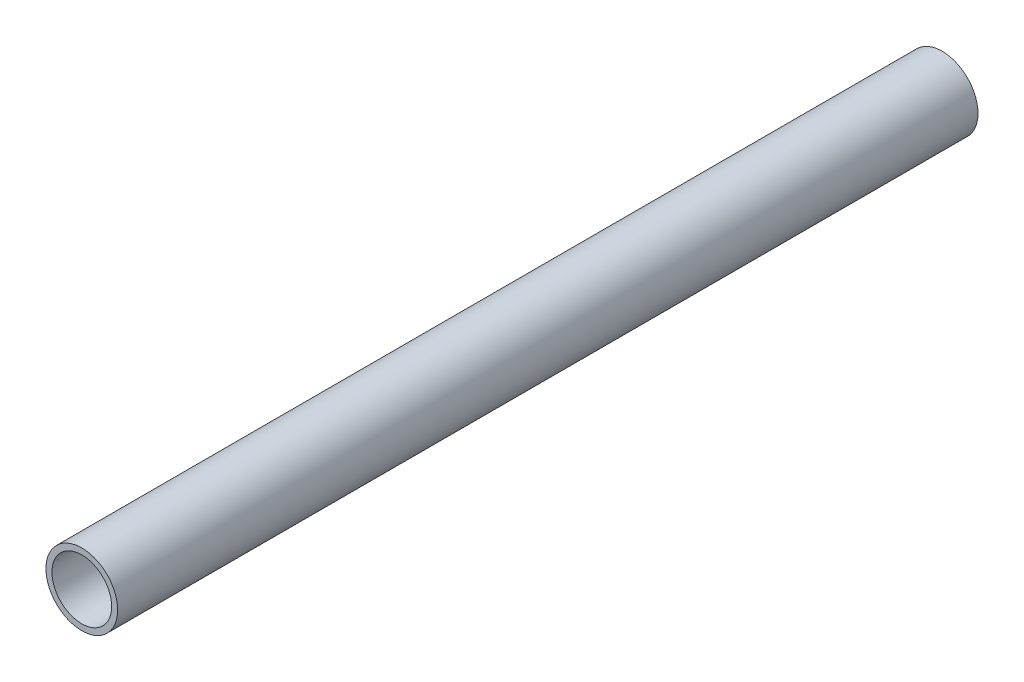
ISO-10303-21;
HEADER;
FILE_DESCRIPTION(('STEP AP214'),'2;1');
FILE_NAME('part.step','',(''),(''),'','','');
FILE_SCHEMA(('AUTOMOTIVE_DESIGN { 1 0 10303 214 1 1 1 1 }'));
ENDSEC;
DATA;
#1=APPLICATION_CONTEXT('core data for automotive mechanical design processes');
#2=APPLICATION_PROTOCOL_DEFINITION('international standard','automotive_design',2000,#1);
#3=PRODUCT_CONTEXT('',#1,'mechanical');
#4=PRODUCT('Part','Part','',(#3));
#5=PRODUCT_RELATED_PRODUCT_CATEGORY('part','',(#4));
#6=PRODUCT_DEFINITION_FORMATION('','',#4);
#7=PRODUCT_DEFINITION_CONTEXT('part definition',#1,'design');
#8=PRODUCT_DEFINITION('design','',#6,#7);
#9=PRODUCT_DEFINITION_SHAPE('','',#8);
#10=(LENGTH_UNIT() NAMED_UNIT(*) SI_UNIT(.MILLI.,.METRE.));
#11=(NAMED_UNIT(*) PLANE_ANGLE_UNIT() SI_UNIT($,.RADIAN.));
#12=(NAMED_UNIT(*) SI_UNIT($,.STERADIAN.) SOLID_ANGLE_UNIT());
#13=UNCERTAINTY_MEASURE_WITH_UNIT(LENGTH_MEASURE(1.E-05),#10,'distance_accuracy_value','');
#14=(GEOMETRIC_REPRESENTATION_CONTEXT(3) GLOBAL_UNCERTAINTY_ASSIGNED_CONTEXT((#13)) GLOBAL_UNIT_ASSIGNED_CONTEXT((#10,
#11,#12)) REPRESENTATION_CONTEXT('',''));
#15=CARTESIAN_POINT('',(0.,0.,0.));
#16=DIRECTION('',(0.,0.,1.));
#17=DIRECTION('',(1.,0.,0.));
#18=AXIS2_PLACEMENT_3D('',#15,#16,#17);
#19=CARTESIAN_POINT('',(0.,0.,457.2));
#20=DIRECTION('',(0.,0.,1.));
#21=DIRECTION('',(1.,0.,0.));
#22=AXIS2_PLACEMENT_3D('',#19,#20,#21);
#23=PLANE('',#22);
#24=CARTESIAN_POINT('',(0.,0.,457.2));
#25=DIRECTION('',(0.,0.,1.));
#26=DIRECTION('',(1.,0.,0.));
#27=AXIS2_PLACEMENT_3D('',#24,#25,#26);
#28=CIRCLE('',#27,19.05);
#29=CARTESIAN_POINT('',(19.05,0.,457.2));
#30=VERTEX_POINT('',#29);
#31=EDGE_CURVE('E10',#30,#30,#28,.T.);
#32=ORIENTED_EDGE('',*,*,#31,.T.);
#33=EDGE_LOOP('',(#32));
#34=FACE_BOUND('',#33,.T.);
#35=CARTESIAN_POINT('',(0.,0.,457.2));
#36=DIRECTION('',(0.,0.,1.));
#37=DIRECTION('',(1.,0.,0.));
#38=AXIS2_PLACEMENT_3D('',#35,#36,#37);
#39=CIRCLE('',#38,15.875);
#40=CARTESIAN_POINT('',(15.875,0.,457.2));
#41=VERTEX_POINT('',#40);
#42=EDGE_CURVE('E42',#41,#41,#39,.T.);
#43=ORIENTED_EDGE('',*,*,#42,.F.);
#44=EDGE_LOOP('',(#43));
#45=FACE_BOUND('',#44,.T.);
#46=ADVANCED_FACE('F31',(#34,#45),#23,.T.);
#47=CARTESIAN_POINT('',(0.,0.,0.));
#48=DIRECTION('',(0.,0.,1.));
#49=DIRECTION('',(1.,0.,0.));
#50=AXIS2_PLACEMENT_3D('',#47,#48,#49);
#51=PLANE('',#50);
#52=CARTESIAN_POINT('',(0.,0.,0.));
#53=DIRECTION('',(0.,0.,1.));
#54=DIRECTION('',(1.,0.,0.));
#55=AXIS2_PLACEMENT_3D('',#52,#53,#54);
#56=CIRCLE('',#55,19.05);
#57=CARTESIAN_POINT('',(19.05,0.,0.));
#58=VERTEX_POINT('',#57);
#59=EDGE_CURVE('E35',#58,#58,#56,.T.);
#60=ORIENTED_EDGE('',*,*,#59,.F.);
#61=EDGE_LOOP('',(#60));
#62=FACE_BOUND('',#61,.T.);
#63=CARTESIAN_POINT('',(0.,0.,0.));
#64=DIRECTION('',(0.,0.,1.));
#65=DIRECTION('',(1.,0.,0.));
#66=AXIS2_PLACEMENT_3D('',#63,#64,#65);
#67=CIRCLE('',#66,15.875);
#68=CARTESIAN_POINT('',(15.875,0.,0.));
#69=VERTEX_POINT('',#68);
#70=EDGE_CURVE('E44',#69,#69,#67,.T.);
#71=ORIENTED_EDGE('',*,*,#70,.T.);
#72=EDGE_LOOP('',(#71));
#73=FACE_BOUND('',#72,.T.);
#74=ADVANCED_FACE('F54',(#62,#73),#51,.F.);
#75=CARTESIAN_POINT('',(0.,0.,457.2));
#76=DIRECTION('',(0.,0.,-1.));
#77=DIRECTION('',(-1.,0.,0.));
#78=AXIS2_PLACEMENT_3D('',#75,#76,#77);
#79=CYLINDRICAL_SURFACE('',#78,19.05);
#80=ORIENTED_EDGE('',*,*,#31,.F.);
#81=EDGE_LOOP('',(#80));
#82=FACE_BOUND('',#81,.T.);
#83=ORIENTED_EDGE('',*,*,#59,.T.);
#84=EDGE_LOOP('',(#83));
#85=FACE_BOUND('',#84,.T.);
#86=ADVANCED_FACE('F33',(#82,#85),#79,.T.);
#87=CARTESIAN_POINT('',(0.,0.,457.2));
#88=DIRECTION('',(0.,0.,-1.));
#89=DIRECTION('',(-1.,0.,0.));
#90=AXIS2_PLACEMENT_3D('',#87,#88,#89);
#91=CYLINDRICAL_SURFACE('',#90,15.875);
#92=ORIENTED_EDGE('',*,*,#42,.T.);
#93=EDGE_LOOP('',(#92));
#94=FACE_BOUND('',#93,.T.);
#95=ORIENTED_EDGE('',*,*,#70,.F.);
#96=EDGE_LOOP('',(#95));
#97=FACE_BOUND('',#96,.T.);
#98=ADVANCED_FACE('F50',(#94,#97),#91,.F.);
#99=CLOSED_SHELL('',(#46,#74,#86,#98));
#100=MANIFOLD_SOLID_BREP('B2',#99);
#101=ADVANCED_BREP_SHAPE_REPRESENTATION('',(#18,#100),#14);
#102=SHAPE_DEFINITION_REPRESENTATION(#9,#101);
ENDSEC;
END-ISO-10303-21;
